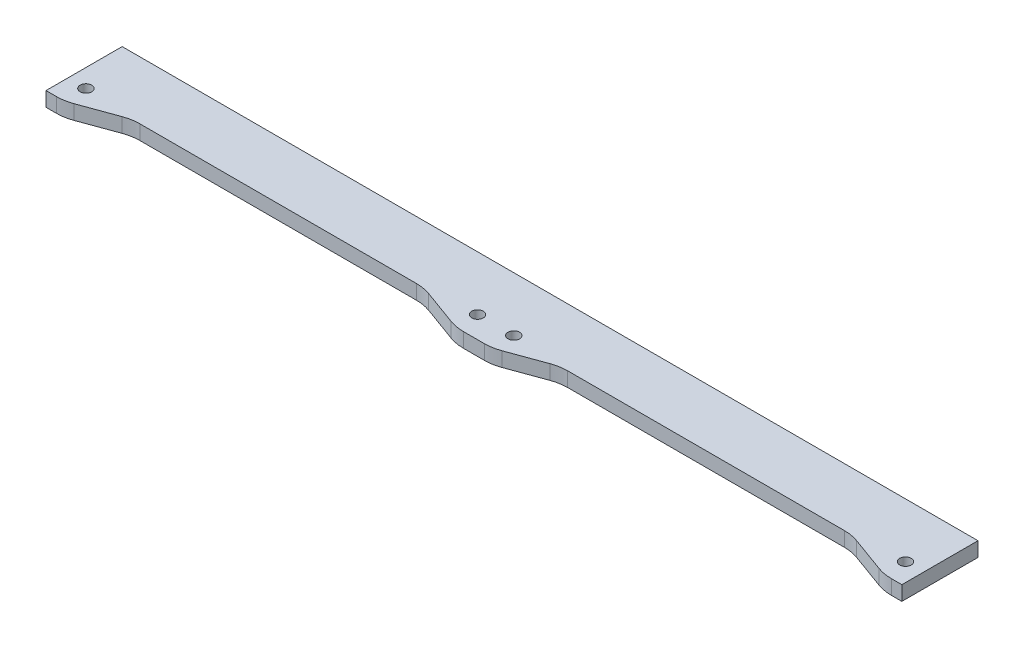
ISO-10303-21;
HEADER;
FILE_DESCRIPTION(('STEP AP214'),'2;1');
FILE_NAME('part.step','',(''),(''),'','','');
FILE_SCHEMA(('AUTOMOTIVE_DESIGN { 1 0 10303 214 1 1 1 1 }'));
ENDSEC;
DATA;
#1=APPLICATION_CONTEXT('core data for automotive mechanical design processes');
#2=APPLICATION_PROTOCOL_DEFINITION('international standard','automotive_design',2000,#1);
#3=PRODUCT_CONTEXT('',#1,'mechanical');
#4=PRODUCT('Part','Part','',(#3));
#5=PRODUCT_RELATED_PRODUCT_CATEGORY('part','',(#4));
#6=PRODUCT_DEFINITION_FORMATION('','',#4);
#7=PRODUCT_DEFINITION_CONTEXT('part definition',#1,'design');
#8=PRODUCT_DEFINITION('design','',#6,#7);
#9=PRODUCT_DEFINITION_SHAPE('','',#8);
#10=(LENGTH_UNIT() NAMED_UNIT(*) SI_UNIT(.MILLI.,.METRE.));
#11=(NAMED_UNIT(*) PLANE_ANGLE_UNIT() SI_UNIT($,.RADIAN.));
#12=(NAMED_UNIT(*) SI_UNIT($,.STERADIAN.) SOLID_ANGLE_UNIT());
#13=UNCERTAINTY_MEASURE_WITH_UNIT(LENGTH_MEASURE(1.E-05),#10,'distance_accuracy_value','');
#14=(GEOMETRIC_REPRESENTATION_CONTEXT(3) GLOBAL_UNCERTAINTY_ASSIGNED_CONTEXT((#13)) GLOBAL_UNIT_ASSIGNED_CONTEXT((#10,
#11,#12)) REPRESENTATION_CONTEXT('',''));
#15=CARTESIAN_POINT('',(0.,0.,0.));
#16=DIRECTION('',(0.,0.,1.));
#17=DIRECTION('',(1.,0.,0.));
#18=AXIS2_PLACEMENT_3D('',#15,#16,#17);
#19=CARTESIAN_POINT('',(39.9880894309982,10.,109.866372758799));
#20=DIRECTION('',(-0.34202014332567,0.,-0.939692620785908));
#21=DIRECTION('',(-0.939692620785908,0.,0.34202014332567));
#22=AXIS2_PLACEMENT_3D('',#19,#20,#21);
#23=PLANE('',#22);
#24=DIRECTION('',(0.939692620785908,0.,-0.34202014332567));
#25=VECTOR('',#24,1.);
#26=CARTESIAN_POINT('',(39.9880894309982,0.,109.866372758799));
#27=LINE('',#26,#25);
#28=CARTESIAN_POINT('',(312.470794878516,0.,10.6907786235773));
#29=VERTEX_POINT('',#28);
#30=CARTESIAN_POINT('',(336.872672864667,0.,1.8092213764227));
#31=VERTEX_POINT('',#30);
#32=EDGE_CURVE('E264',#29,#31,#27,.T.);
#33=ORIENTED_EDGE('',*,*,#32,.T.);
#34=DIRECTION('',(0.,-1.,0.));
#35=VECTOR('',#34,1.);
#36=CARTESIAN_POINT('',(336.872672864667,10.,1.80922137642281));
#37=LINE('',#36,#35);
#38=CARTESIAN_POINT('',(336.872672864667,10.,1.8092213764227));
#39=VERTEX_POINT('',#38);
#40=EDGE_CURVE('E387',#31,#39,#37,.F.);
#41=ORIENTED_EDGE('',*,*,#40,.T.);
#42=DIRECTION('',(0.939692620785908,0.,-0.34202014332567));
#43=VECTOR('',#42,1.);
#44=CARTESIAN_POINT('',(39.9880894309982,10.,109.866372758799));
#45=LINE('',#44,#43);
#46=CARTESIAN_POINT('',(312.470794878516,10.,10.6907786235773));
#47=VERTEX_POINT('',#46);
#48=EDGE_CURVE('E453',#47,#39,#45,.T.);
#49=ORIENTED_EDGE('',*,*,#48,.F.);
#50=DIRECTION('',(0.,-1.,0.));
#51=VECTOR('',#50,1.);
#52=CARTESIAN_POINT('',(312.470794878516,0.,10.6907786235773));
#53=LINE('',#52,#51);
#54=EDGE_CURVE('E383',#47,#29,#53,.T.);
#55=ORIENTED_EDGE('',*,*,#54,.T.);
#56=EDGE_LOOP('',(#33,#41,#49,#55));
#57=FACE_BOUND('',#56,.T.);
#58=ADVANCED_FACE('F46',(#57),#23,.F.);
#59=CARTESIAN_POINT('',(0.,10.,0.));
#60=DIRECTION('',(0.,0.,-1.));
#61=DIRECTION('',(-1.,0.,0.));
#62=AXIS2_PLACEMENT_3D('',#59,#60,#61);
#63=PLANE('',#62);
#64=DIRECTION('',(1.,0.,0.));
#65=VECTOR('',#64,1.);
#66=CARTESIAN_POINT('',(0.,0.,0.));
#67=LINE('',#66,#65);
#68=CARTESIAN_POINT('',(347.133277164437,0.,0.));
#69=VERTEX_POINT('',#68);
#70=CARTESIAN_POINT('',(537.866722835564,0.,0.));
#71=VERTEX_POINT('',#70);
#72=EDGE_CURVE('E268',#69,#71,#67,.T.);
#73=ORIENTED_EDGE('',*,*,#72,.T.);
#74=DIRECTION('',(0.,-1.,0.));
#75=VECTOR('',#74,1.);
#76=CARTESIAN_POINT('',(537.866722835564,10.,0.));
#77=LINE('',#76,#75);
#78=CARTESIAN_POINT('',(537.866722835564,10.,0.));
#79=VERTEX_POINT('',#78);
#80=EDGE_CURVE('E62',#71,#79,#77,.F.);
#81=ORIENTED_EDGE('',*,*,#80,.T.);
#82=DIRECTION('',(1.,0.,0.));
#83=VECTOR('',#82,1.);
#84=CARTESIAN_POINT('',(0.,10.,0.));
#85=LINE('',#84,#83);
#86=CARTESIAN_POINT('',(347.133277164437,10.,0.));
#87=VERTEX_POINT('',#86);
#88=EDGE_CURVE('E220',#87,#79,#85,.T.);
#89=ORIENTED_EDGE('',*,*,#88,.F.);
#90=DIRECTION('',(0.,-1.,0.));
#91=VECTOR('',#90,1.);
#92=CARTESIAN_POINT('',(347.133277164437,0.,0.));
#93=LINE('',#92,#91);
#94=EDGE_CURVE('E377',#87,#69,#93,.T.);
#95=ORIENTED_EDGE('',*,*,#94,.T.);
#96=EDGE_LOOP('',(#73,#81,#89,#95));
#97=FACE_BOUND('',#96,.T.);
#98=ADVANCED_FACE('F488',(#97),#63,.F.);
#99=CARTESIAN_POINT('',(63.537244488855,10.,-174.567144527496));
#100=DIRECTION('',(-0.342020143325671,0.,0.939692620785908));
#101=DIRECTION('',(0.939692620785908,0.,0.342020143325671));
#102=AXIS2_PLACEMENT_3D('',#99,#100,#101);
#103=PLANE('',#102);
#104=DIRECTION('',(-0.939692620785908,0.,-0.342020143325671));
#105=VECTOR('',#104,1.);
#106=CARTESIAN_POINT('',(63.537244488855,0.,-174.567144527496));
#107=LINE('',#106,#105);
#108=CARTESIAN_POINT('',(572.529205121484,0.,10.6907786235771));
#109=VERTEX_POINT('',#108);
#110=CARTESIAN_POINT('',(548.127327135334,0.,1.80922137642281));
#111=VERTEX_POINT('',#110);
#112=EDGE_CURVE('E271',#109,#111,#107,.T.);
#113=ORIENTED_EDGE('',*,*,#112,.F.);
#114=DIRECTION('',(0.,-1.,0.));
#115=VECTOR('',#114,1.);
#116=CARTESIAN_POINT('',(572.529205121484,10.,10.6907786235771));
#117=LINE('',#116,#115);
#118=CARTESIAN_POINT('',(572.529205121484,10.,10.6907786235771));
#119=VERTEX_POINT('',#118);
#120=EDGE_CURVE('E366',#109,#119,#117,.F.);
#121=ORIENTED_EDGE('',*,*,#120,.T.);
#122=DIRECTION('',(-0.939692620785908,0.,-0.342020143325671));
#123=VECTOR('',#122,1.);
#124=CARTESIAN_POINT('',(63.537244488855,10.,-174.567144527496));
#125=LINE('',#124,#123);
#126=CARTESIAN_POINT('',(548.127327135334,10.,1.80922137642281));
#127=VERTEX_POINT('',#126);
#128=EDGE_CURVE('E215',#119,#127,#125,.T.);
#129=ORIENTED_EDGE('',*,*,#128,.T.);
#130=DIRECTION('',(0.,-1.,0.));
#131=VECTOR('',#130,1.);
#132=CARTESIAN_POINT('',(548.127327135334,10.,1.80922137642281));
#133=LINE('',#132,#131);
#134=EDGE_CURVE('E362',#127,#111,#133,.T.);
#135=ORIENTED_EDGE('',*,*,#134,.T.);
#136=EDGE_LOOP('',(#113,#121,#129,#135));
#137=FACE_BOUND('',#136,.T.);
#138=ADVANCED_FACE('F493',(#137),#103,.T.);
#139=CARTESIAN_POINT('',(0.,10.,12.5000000000001));
#140=DIRECTION('',(0.,0.,1.));
#141=DIRECTION('',(1.,0.,0.));
#142=AXIS2_PLACEMENT_3D('',#139,#140,#141);
#143=PLANE('',#142);
#144=DIRECTION('',(-1.,0.,0.));
#145=VECTOR('',#144,1.);
#146=CARTESIAN_POINT('',(0.,10.,12.5000000000001));
#147=LINE('',#146,#145);
#148=CARTESIAN_POINT('',(590.,10.,12.5));
#149=VERTEX_POINT('',#148);
#150=CARTESIAN_POINT('',(582.789809421254,10.,12.5));
#151=VERTEX_POINT('',#150);
#152=EDGE_CURVE('E190',#149,#151,#147,.T.);
#153=ORIENTED_EDGE('',*,*,#152,.T.);
#154=DIRECTION('',(0.,-1.,0.));
#155=VECTOR('',#154,1.);
#156=CARTESIAN_POINT('',(582.789809421254,10.,12.5));
#157=LINE('',#156,#155);
#158=CARTESIAN_POINT('',(582.789809421254,0.,12.5));
#159=VERTEX_POINT('',#158);
#160=EDGE_CURVE('E350',#151,#159,#157,.T.);
#161=ORIENTED_EDGE('',*,*,#160,.T.);
#162=DIRECTION('',(-1.,0.,0.));
#163=VECTOR('',#162,1.);
#164=CARTESIAN_POINT('',(0.,0.,12.5000000000001));
#165=LINE('',#164,#163);
#166=CARTESIAN_POINT('',(590.,0.,12.5));
#167=VERTEX_POINT('',#166);
#168=EDGE_CURVE('E193',#167,#159,#165,.T.);
#169=ORIENTED_EDGE('',*,*,#168,.F.);
#170=DIRECTION('',(0.,-1.,0.));
#171=VECTOR('',#170,1.);
#172=CARTESIAN_POINT('',(590.,10.,12.5));
#173=LINE('',#172,#171);
#174=EDGE_CURVE('E185',#149,#167,#173,.T.);
#175=ORIENTED_EDGE('',*,*,#174,.F.);
#176=EDGE_LOOP('',(#153,#161,#169,#175));
#177=FACE_BOUND('',#176,.T.);
#178=ADVANCED_FACE('F187',(#177),#143,.T.);
#179=CARTESIAN_POINT('',(590.,10.,0.));
#180=DIRECTION('',(-1.,0.,0.));
#181=DIRECTION('',(0.,0.,1.));
#182=AXIS2_PLACEMENT_3D('',#179,#180,#181);
#183=PLANE('',#182);
#184=DIRECTION('',(0.,0.,-1.));
#185=VECTOR('',#184,1.);
#186=CARTESIAN_POINT('',(590.,0.,0.));
#187=LINE('',#186,#185);
#188=CARTESIAN_POINT('',(590.,0.,-40.0000000000001));
#189=VERTEX_POINT('',#188);
#190=EDGE_CURVE('E278',#167,#189,#187,.T.);
#191=ORIENTED_EDGE('',*,*,#190,.T.);
#192=DIRECTION('',(0.,-1.,0.));
#193=VECTOR('',#192,1.);
#194=CARTESIAN_POINT('',(590.,10.,-40.0000000000001));
#195=LINE('',#194,#193);
#196=CARTESIAN_POINT('',(590.,10.,-40.0000000000001));
#197=VERTEX_POINT('',#196);
#198=EDGE_CURVE('E199',#197,#189,#195,.T.);
#199=ORIENTED_EDGE('',*,*,#198,.F.);
#200=DIRECTION('',(0.,0.,-1.));
#201=VECTOR('',#200,1.);
#202=CARTESIAN_POINT('',(590.,10.,0.));
#203=LINE('',#202,#201);
#204=EDGE_CURVE('E202',#149,#197,#203,.T.);
#205=ORIENTED_EDGE('',*,*,#204,.F.);
#206=ORIENTED_EDGE('',*,*,#174,.T.);
#207=EDGE_LOOP('',(#191,#199,#205,#206));
#208=FACE_BOUND('',#207,.T.);
#209=ADVANCED_FACE('F203',(#208),#183,.F.);
#210=CARTESIAN_POINT('',(0.,10.,-40.));
#211=DIRECTION('',(0.,0.,-1.));
#212=DIRECTION('',(-1.,0.,0.));
#213=AXIS2_PLACEMENT_3D('',#210,#211,#212);
#214=PLANE('',#213);
#215=DIRECTION('',(1.,0.,0.));
#216=VECTOR('',#215,1.);
#217=CARTESIAN_POINT('',(0.,0.,-40.));
#218=LINE('',#217,#216);
#219=CARTESIAN_POINT('',(0.,0.,-40.));
#220=VERTEX_POINT('',#219);
#221=EDGE_CURVE('E281',#220,#189,#218,.T.);
#222=ORIENTED_EDGE('',*,*,#221,.F.);
#223=DIRECTION('',(0.,-1.,0.));
#224=VECTOR('',#223,1.);
#225=CARTESIAN_POINT('',(0.,10.,-40.));
#226=LINE('',#225,#224);
#227=CARTESIAN_POINT('',(0.,10.,-40.));
#228=VERTEX_POINT('',#227);
#229=EDGE_CURVE('E320',#228,#220,#226,.T.);
#230=ORIENTED_EDGE('',*,*,#229,.F.);
#231=DIRECTION('',(1.,0.,0.));
#232=VECTOR('',#231,1.);
#233=CARTESIAN_POINT('',(0.,10.,-40.));
#234=LINE('',#233,#232);
#235=EDGE_CURVE('E207',#228,#197,#234,.T.);
#236=ORIENTED_EDGE('',*,*,#235,.T.);
#237=ORIENTED_EDGE('',*,*,#198,.T.);
#238=EDGE_LOOP('',(#222,#230,#236,#237));
#239=FACE_BOUND('',#238,.T.);
#240=ADVANCED_FACE('F661',(#239),#214,.T.);
#241=CARTESIAN_POINT('',(0.,10.,0.));
#242=DIRECTION('',(-1.,0.,0.));
#243=DIRECTION('',(0.,0.,1.));
#244=AXIS2_PLACEMENT_3D('',#241,#242,#243);
#245=PLANE('',#244);
#246=DIRECTION('',(0.,0.,-1.));
#247=VECTOR('',#246,1.);
#248=CARTESIAN_POINT('',(0.,0.,0.));
#249=LINE('',#248,#247);
#250=CARTESIAN_POINT('',(0.,0.,12.5));
#251=VERTEX_POINT('',#250);
#252=EDGE_CURVE('E285',#251,#220,#249,.T.);
#253=ORIENTED_EDGE('',*,*,#252,.F.);
#254=DIRECTION('',(0.,-1.,0.));
#255=VECTOR('',#254,1.);
#256=CARTESIAN_POINT('',(0.,10.,12.5));
#257=LINE('',#256,#255);
#258=CARTESIAN_POINT('',(0.,10.,12.5));
#259=VERTEX_POINT('',#258);
#260=EDGE_CURVE('E259',#259,#251,#257,.T.);
#261=ORIENTED_EDGE('',*,*,#260,.F.);
#262=DIRECTION('',(0.,0.,-1.));
#263=VECTOR('',#262,1.);
#264=CARTESIAN_POINT('',(0.,10.,0.));
#265=LINE('',#264,#263);
#266=EDGE_CURVE('E226',#259,#228,#265,.T.);
#267=ORIENTED_EDGE('',*,*,#266,.T.);
#268=ORIENTED_EDGE('',*,*,#229,.T.);
#269=EDGE_LOOP('',(#253,#261,#267,#268));
#270=FACE_BOUND('',#269,.T.);
#271=ADVANCED_FACE('F651',(#270),#245,.T.);
#272=CARTESIAN_POINT('',(0.,10.,12.5));
#273=DIRECTION('',(0.,0.,-1.));
#274=DIRECTION('',(-1.,0.,0.));
#275=AXIS2_PLACEMENT_3D('',#272,#273,#274);
#276=PLANE('',#275);
#277=DIRECTION('',(1.,0.,0.));
#278=VECTOR('',#277,1.);
#279=CARTESIAN_POINT('',(0.,0.,12.5));
#280=LINE('',#279,#278);
#281=CARTESIAN_POINT('',(7.21019057874603,0.,12.5));
#282=VERTEX_POINT('',#281);
#283=EDGE_CURVE('E289',#251,#282,#280,.T.);
#284=ORIENTED_EDGE('',*,*,#283,.T.);
#285=DIRECTION('',(0.,-1.,0.));
#286=VECTOR('',#285,1.);
#287=CARTESIAN_POINT('',(7.21019057874603,10.,12.5));
#288=LINE('',#287,#286);
#289=CARTESIAN_POINT('',(7.21019057874603,10.,12.5));
#290=VERTEX_POINT('',#289);
#291=EDGE_CURVE('E338',#282,#290,#288,.F.);
#292=ORIENTED_EDGE('',*,*,#291,.T.);
#293=DIRECTION('',(1.,0.,0.));
#294=VECTOR('',#293,1.);
#295=CARTESIAN_POINT('',(0.,10.,12.5));
#296=LINE('',#295,#294);
#297=EDGE_CURVE('E230',#259,#290,#296,.T.);
#298=ORIENTED_EDGE('',*,*,#297,.F.);
#299=ORIENTED_EDGE('',*,*,#260,.T.);
#300=EDGE_LOOP('',(#284,#292,#298,#299));
#301=FACE_BOUND('',#300,.T.);
#302=ADVANCED_FACE('F641',(#301),#276,.F.);
#303=CARTESIAN_POINT('',(5.47964479104729,10.,15.0552003300345));
#304=DIRECTION('',(-0.34202014332567,0.,-0.939692620785908));
#305=DIRECTION('',(-0.939692620785908,0.,0.34202014332567));
#306=AXIS2_PLACEMENT_3D('',#303,#304,#305);
#307=PLANE('',#306);
#308=DIRECTION('',(0.939692620785908,0.,-0.34202014332567));
#309=VECTOR('',#308,1.);
#310=CARTESIAN_POINT('',(5.47964479104729,0.,15.0552003300345));
#311=LINE('',#310,#309);
#312=CARTESIAN_POINT('',(17.4707948785161,0.,10.6907786235773));
#313=VERTEX_POINT('',#312);
#314=CARTESIAN_POINT('',(41.8726728646665,0.,1.80922137642281));
#315=VERTEX_POINT('',#314);
#316=EDGE_CURVE('E293',#313,#315,#311,.T.);
#317=ORIENTED_EDGE('',*,*,#316,.T.);
#318=DIRECTION('',(0.,-1.,0.));
#319=VECTOR('',#318,1.);
#320=CARTESIAN_POINT('',(41.8726728646665,10.,1.80922137642281));
#321=LINE('',#320,#319);
#322=CARTESIAN_POINT('',(41.8726728646665,10.,1.80922137642281));
#323=VERTEX_POINT('',#322);
#324=EDGE_CURVE('E332',#315,#323,#321,.F.);
#325=ORIENTED_EDGE('',*,*,#324,.T.);
#326=DIRECTION('',(0.939692620785908,0.,-0.34202014332567));
#327=VECTOR('',#326,1.);
#328=CARTESIAN_POINT('',(5.47964479104729,10.,15.0552003300345));
#329=LINE('',#328,#327);
#330=CARTESIAN_POINT('',(17.4707948785161,10.,10.6907786235773));
#331=VERTEX_POINT('',#330);
#332=EDGE_CURVE('E234',#331,#323,#329,.T.);
#333=ORIENTED_EDGE('',*,*,#332,.F.);
#334=DIRECTION('',(0.,-1.,0.));
#335=VECTOR('',#334,1.);
#336=CARTESIAN_POINT('',(17.4707948785161,10.,10.6907786235773));
#337=LINE('',#336,#335);
#338=EDGE_CURVE('E328',#331,#313,#337,.T.);
#339=ORIENTED_EDGE('',*,*,#338,.T.);
#340=EDGE_LOOP('',(#317,#325,#333,#339));
#341=FACE_BOUND('',#340,.T.);
#342=ADVANCED_FACE('F633',(#341),#307,.F.);
#343=CARTESIAN_POINT('',(52.1332771644366,0.,0.));
#344=VERTEX_POINT('',#343);
#345=CARTESIAN_POINT('',(242.866722835563,0.,0.));
#346=VERTEX_POINT('',#345);
#347=EDGE_CURVE('E272',#344,#346,#67,.T.);
#348=ORIENTED_EDGE('',*,*,#347,.T.);
#349=DIRECTION('',(0.,-1.,0.));
#350=VECTOR('',#349,1.);
#351=CARTESIAN_POINT('',(242.866722835563,10.,0.));
#352=LINE('',#351,#350);
#353=CARTESIAN_POINT('',(242.866722835563,10.,0.));
#354=VERTEX_POINT('',#353);
#355=EDGE_CURVE('E404',#346,#354,#352,.F.);
#356=ORIENTED_EDGE('',*,*,#355,.T.);
#357=CARTESIAN_POINT('',(52.1332771644366,10.,0.));
#358=VERTEX_POINT('',#357);
#359=EDGE_CURVE('E238',#358,#354,#85,.T.);
#360=ORIENTED_EDGE('',*,*,#359,.F.);
#361=DIRECTION('',(0.,-1.,0.));
#362=VECTOR('',#361,1.);
#363=CARTESIAN_POINT('',(52.1332771644366,0.,0.));
#364=LINE('',#363,#362);
#365=EDGE_CURVE('E198',#358,#344,#364,.T.);
#366=ORIENTED_EDGE('',*,*,#365,.T.);
#367=EDGE_LOOP('',(#348,#356,#360,#366));
#368=FACE_BOUND('',#367,.T.);
#369=ADVANCED_FACE('F429',(#368),#63,.F.);
#370=CARTESIAN_POINT('',(29.0287998489036,10.,-79.7559720987302));
#371=DIRECTION('',(-0.342020143325669,0.,0.939692620785908));
#372=DIRECTION('',(0.939692620785908,0.,0.342020143325669));
#373=AXIS2_PLACEMENT_3D('',#370,#371,#372);
#374=PLANE('',#373);
#375=DIRECTION('',(-0.939692620785908,0.,-0.342020143325669));
#376=VECTOR('',#375,1.);
#377=CARTESIAN_POINT('',(29.0287998489036,10.,-79.7559720987302));
#378=LINE('',#377,#376);
#379=CARTESIAN_POINT('',(277.529205121484,10.,10.6907786235773));
#380=VERTEX_POINT('',#379);
#381=CARTESIAN_POINT('',(253.127327135333,10.,1.80922137642281));
#382=VERTEX_POINT('',#381);
#383=EDGE_CURVE('E239',#380,#382,#378,.T.);
#384=ORIENTED_EDGE('',*,*,#383,.T.);
#385=DIRECTION('',(0.,-1.,0.));
#386=VECTOR('',#385,1.);
#387=CARTESIAN_POINT('',(253.127327135333,10.,1.8092213764227));
#388=LINE('',#387,#386);
#389=CARTESIAN_POINT('',(253.127327135333,0.,1.80922137642281));
#390=VERTEX_POINT('',#389);
#391=EDGE_CURVE('E400',#382,#390,#388,.T.);
#392=ORIENTED_EDGE('',*,*,#391,.T.);
#393=DIRECTION('',(-0.939692620785908,0.,-0.342020143325669));
#394=VECTOR('',#393,1.);
#395=CARTESIAN_POINT('',(29.0287998489036,0.,-79.7559720987302));
#396=LINE('',#395,#394);
#397=CARTESIAN_POINT('',(277.529205121484,0.,10.6907786235773));
#398=VERTEX_POINT('',#397);
#399=EDGE_CURVE('E297',#398,#390,#396,.T.);
#400=ORIENTED_EDGE('',*,*,#399,.F.);
#401=DIRECTION('',(0.,-1.,0.));
#402=VECTOR('',#401,1.);
#403=CARTESIAN_POINT('',(277.529205121484,10.,10.6907786235773));
#404=LINE('',#403,#402);
#405=EDGE_CURVE('E397',#398,#380,#404,.F.);
#406=ORIENTED_EDGE('',*,*,#405,.T.);
#407=EDGE_LOOP('',(#384,#392,#400,#406));
#408=FACE_BOUND('',#407,.T.);
#409=ADVANCED_FACE('F439',(#408),#374,.T.);
#410=CARTESIAN_POINT('',(12.5,10.,-2.5));
#411=DIRECTION('',(0.,-1.,0.));
#412=DIRECTION('',(0.,0.,-1.));
#413=AXIS2_PLACEMENT_3D('',#410,#411,#412);
#414=CYLINDRICAL_SURFACE('',#413,4.);
#415=CARTESIAN_POINT('',(12.5,10.,-2.5));
#416=DIRECTION('',(0.,1.,0.));
#417=DIRECTION('',(0.,0.,1.));
#418=AXIS2_PLACEMENT_3D('',#415,#416,#417);
#419=CIRCLE('',#418,4.);
#420=CARTESIAN_POINT('',(12.5,10.,1.5));
#421=VERTEX_POINT('',#420);
#422=EDGE_CURVE('E251',#421,#421,#419,.T.);
#423=ORIENTED_EDGE('',*,*,#422,.T.);
#424=EDGE_LOOP('',(#423));
#425=FACE_BOUND('',#424,.T.);
#426=CARTESIAN_POINT('',(12.5,0.,-2.5));
#427=DIRECTION('',(0.,1.,0.));
#428=DIRECTION('',(0.,0.,1.));
#429=AXIS2_PLACEMENT_3D('',#426,#427,#428);
#430=CIRCLE('',#429,4.);
#431=CARTESIAN_POINT('',(12.5,0.,1.5));
#432=VERTEX_POINT('',#431);
#433=EDGE_CURVE('E309',#432,#432,#430,.T.);
#434=ORIENTED_EDGE('',*,*,#433,.F.);
#435=EDGE_LOOP('',(#434));
#436=FACE_BOUND('',#435,.T.);
#437=ADVANCED_FACE('F606',(#425,#436),#414,.F.);
#438=CARTESIAN_POINT('',(577.5,10.,-2.50000000000006));
#439=DIRECTION('',(0.,-1.,0.));
#440=DIRECTION('',(0.,0.,-1.));
#441=AXIS2_PLACEMENT_3D('',#438,#439,#440);
#442=CYLINDRICAL_SURFACE('',#441,3.99999999999999);
#443=CARTESIAN_POINT('',(577.5,10.,-2.50000000000006));
#444=DIRECTION('',(0.,1.,0.));
#445=DIRECTION('',(0.,0.,1.));
#446=AXIS2_PLACEMENT_3D('',#443,#444,#445);
#447=CIRCLE('',#446,3.99999999999999);
#448=CARTESIAN_POINT('',(577.5,10.,1.49999999999993));
#449=VERTEX_POINT('',#448);
#450=EDGE_CURVE('E247',#449,#449,#447,.F.);
#451=ORIENTED_EDGE('',*,*,#450,.F.);
#452=EDGE_LOOP('',(#451));
#453=FACE_BOUND('',#452,.T.);
#454=CARTESIAN_POINT('',(577.5,0.,-2.50000000000006));
#455=DIRECTION('',(0.,1.,0.));
#456=DIRECTION('',(0.,0.,1.));
#457=AXIS2_PLACEMENT_3D('',#454,#455,#456);
#458=CIRCLE('',#457,3.99999999999999);
#459=CARTESIAN_POINT('',(577.5,0.,1.49999999999993));
#460=VERTEX_POINT('',#459);
#461=EDGE_CURVE('E305',#460,#460,#458,.F.);
#462=ORIENTED_EDGE('',*,*,#461,.T.);
#463=EDGE_LOOP('',(#462));
#464=FACE_BOUND('',#463,.T.);
#465=ADVANCED_FACE('F597',(#453,#464),#442,.F.);
#466=CARTESIAN_POINT('',(0.,10.,12.5000000000001));
#467=DIRECTION('',(0.,0.,1.));
#468=DIRECTION('',(1.,0.,0.));
#469=AXIS2_PLACEMENT_3D('',#466,#467,#468);
#470=PLANE('',#469);
#471=DIRECTION('',(-1.,0.,0.));
#472=VECTOR('',#471,1.);
#473=CARTESIAN_POINT('',(0.,0.,12.5000000000001));
#474=LINE('',#473,#472);
#475=CARTESIAN_POINT('',(302.210190578746,0.,12.5));
#476=VERTEX_POINT('',#475);
#477=CARTESIAN_POINT('',(287.789809421254,0.,12.5));
#478=VERTEX_POINT('',#477);
#479=EDGE_CURVE('E301',#476,#478,#474,.T.);
#480=ORIENTED_EDGE('',*,*,#479,.F.);
#481=DIRECTION('',(0.,-1.,0.));
#482=VECTOR('',#481,1.);
#483=CARTESIAN_POINT('',(302.210190578746,10.,12.5));
#484=LINE('',#483,#482);
#485=CARTESIAN_POINT('',(302.210190578746,10.,12.5));
#486=VERTEX_POINT('',#485);
#487=EDGE_CURVE('E394',#476,#486,#484,.F.);
#488=ORIENTED_EDGE('',*,*,#487,.T.);
#489=DIRECTION('',(-1.,0.,0.));
#490=VECTOR('',#489,1.);
#491=CARTESIAN_POINT('',(0.,10.,12.5000000000001));
#492=LINE('',#491,#490);
#493=CARTESIAN_POINT('',(287.789809421254,10.,12.5));
#494=VERTEX_POINT('',#493);
#495=EDGE_CURVE('E243',#486,#494,#492,.T.);
#496=ORIENTED_EDGE('',*,*,#495,.T.);
#497=DIRECTION('',(0.,-1.,0.));
#498=VECTOR('',#497,1.);
#499=CARTESIAN_POINT('',(287.789809421254,10.,12.5));
#500=LINE('',#499,#498);
#501=EDGE_CURVE('E390',#494,#478,#500,.T.);
#502=ORIENTED_EDGE('',*,*,#501,.T.);
#503=EDGE_LOOP('',(#480,#488,#496,#502));
#504=FACE_BOUND('',#503,.T.);
#505=ADVANCED_FACE('F447',(#504),#470,.T.);
#506=CARTESIAN_POINT('',(307.5,10.,-2.5));
#507=DIRECTION('',(0.,-1.,0.));
#508=DIRECTION('',(0.,0.,-1.));
#509=AXIS2_PLACEMENT_3D('',#506,#507,#508);
#510=CYLINDRICAL_SURFACE('',#509,3.99999999999999);
#511=CARTESIAN_POINT('',(307.5,10.,-2.5));
#512=DIRECTION('',(0.,1.,0.));
#513=DIRECTION('',(0.,0.,1.));
#514=AXIS2_PLACEMENT_3D('',#511,#512,#513);
#515=CIRCLE('',#514,3.99999999999999);
#516=CARTESIAN_POINT('',(307.5,10.,1.49999999999999));
#517=VERTEX_POINT('',#516);
#518=EDGE_CURVE('E317',#517,#517,#515,.F.);
#519=ORIENTED_EDGE('',*,*,#518,.F.);
#520=EDGE_LOOP('',(#519));
#521=FACE_BOUND('',#520,.T.);
#522=CARTESIAN_POINT('',(307.5,0.,-2.5));
#523=DIRECTION('',(0.,1.,0.));
#524=DIRECTION('',(0.,0.,1.));
#525=AXIS2_PLACEMENT_3D('',#522,#523,#524);
#526=CIRCLE('',#525,3.99999999999999);
#527=CARTESIAN_POINT('',(307.5,0.,1.49999999999999));
#528=VERTEX_POINT('',#527);
#529=EDGE_CURVE('E260',#528,#528,#526,.F.);
#530=ORIENTED_EDGE('',*,*,#529,.T.);
#531=EDGE_LOOP('',(#530));
#532=FACE_BOUND('',#531,.T.);
#533=ADVANCED_FACE('F468',(#521,#532),#510,.F.);
#534=CARTESIAN_POINT('',(282.5,10.,-2.5));
#535=DIRECTION('',(0.,-1.,0.));
#536=DIRECTION('',(0.,0.,-1.));
#537=AXIS2_PLACEMENT_3D('',#534,#535,#536);
#538=CYLINDRICAL_SURFACE('',#537,3.99999999999999);
#539=CARTESIAN_POINT('',(282.5,10.,-2.5));
#540=DIRECTION('',(0.,1.,0.));
#541=DIRECTION('',(0.,0.,1.));
#542=AXIS2_PLACEMENT_3D('',#539,#540,#541);
#543=CIRCLE('',#542,3.99999999999999);
#544=CARTESIAN_POINT('',(282.5,10.,1.49999999999999));
#545=VERTEX_POINT('',#544);
#546=EDGE_CURVE('E255',#545,#545,#543,.T.);
#547=ORIENTED_EDGE('',*,*,#546,.T.);
#548=EDGE_LOOP('',(#547));
#549=FACE_BOUND('',#548,.T.);
#550=CARTESIAN_POINT('',(282.5,0.,-2.5));
#551=DIRECTION('',(0.,1.,0.));
#552=DIRECTION('',(0.,0.,1.));
#553=AXIS2_PLACEMENT_3D('',#550,#551,#552);
#554=CIRCLE('',#553,3.99999999999999);
#555=CARTESIAN_POINT('',(282.5,0.,1.49999999999999));
#556=VERTEX_POINT('',#555);
#557=EDGE_CURVE('E313',#556,#556,#554,.T.);
#558=ORIENTED_EDGE('',*,*,#557,.F.);
#559=EDGE_LOOP('',(#558));
#560=FACE_BOUND('',#559,.T.);
#561=ADVANCED_FACE('F471',(#549,#560),#538,.F.);
#562=CARTESIAN_POINT('',(0.,10.,0.));
#563=DIRECTION('',(0.,1.,0.));
#564=DIRECTION('',(0.,0.,1.));
#565=AXIS2_PLACEMENT_3D('',#562,#563,#564);
#566=PLANE('',#565);
#567=ORIENTED_EDGE('',*,*,#518,.T.);
#568=EDGE_LOOP('',(#567));
#569=FACE_BOUND('',#568,.T.);
#570=ORIENTED_EDGE('',*,*,#128,.F.);
#571=CARTESIAN_POINT('',(582.789809421254,10.,-17.5000000000001));
#572=DIRECTION('',(0.,1.,0.));
#573=DIRECTION('',(0.,0.,1.));
#574=AXIS2_PLACEMENT_3D('',#571,#572,#573);
#575=CIRCLE('',#574,30.);
#576=EDGE_CURVE('E213',#119,#151,#575,.T.);
#577=ORIENTED_EDGE('',*,*,#576,.T.);
#578=ORIENTED_EDGE('',*,*,#152,.F.);
#579=ORIENTED_EDGE('',*,*,#204,.T.);
#580=ORIENTED_EDGE('',*,*,#235,.F.);
#581=ORIENTED_EDGE('',*,*,#266,.F.);
#582=ORIENTED_EDGE('',*,*,#297,.T.);
#583=CARTESIAN_POINT('',(7.21019057874603,10.,-17.5));
#584=DIRECTION('',(0.,1.,0.));
#585=DIRECTION('',(0.,0.,1.));
#586=AXIS2_PLACEMENT_3D('',#583,#584,#585);
#587=CIRCLE('',#586,30.);
#588=EDGE_CURVE('E341',#290,#331,#587,.T.);
#589=ORIENTED_EDGE('',*,*,#588,.T.);
#590=ORIENTED_EDGE('',*,*,#332,.T.);
#591=CARTESIAN_POINT('',(52.1332771644366,10.,30.));
#592=DIRECTION('',(0.,1.,0.));
#593=DIRECTION('',(0.,0.,1.));
#594=AXIS2_PLACEMENT_3D('',#591,#592,#593);
#595=CIRCLE('',#594,30.);
#596=EDGE_CURVE('E347',#323,#358,#595,.F.);
#597=ORIENTED_EDGE('',*,*,#596,.T.);
#598=ORIENTED_EDGE('',*,*,#359,.T.);
#599=CARTESIAN_POINT('',(242.866722835563,10.,30.));
#600=DIRECTION('',(0.,1.,0.));
#601=DIRECTION('',(0.,0.,1.));
#602=AXIS2_PLACEMENT_3D('',#599,#600,#601);
#603=CIRCLE('',#602,30.);
#604=EDGE_CURVE('E11',#354,#382,#603,.F.);
#605=ORIENTED_EDGE('',*,*,#604,.T.);
#606=ORIENTED_EDGE('',*,*,#383,.F.);
#607=CARTESIAN_POINT('',(287.789809421254,10.,-17.5));
#608=DIRECTION('',(0.,1.,0.));
#609=DIRECTION('',(0.,0.,1.));
#610=AXIS2_PLACEMENT_3D('',#607,#608,#609);
#611=CIRCLE('',#610,30.);
#612=EDGE_CURVE('E369',#380,#494,#611,.T.);
#613=ORIENTED_EDGE('',*,*,#612,.T.);
#614=ORIENTED_EDGE('',*,*,#495,.F.);
#615=CARTESIAN_POINT('',(302.210190578746,10.,-17.5));
#616=DIRECTION('',(0.,1.,0.));
#617=DIRECTION('',(0.,0.,1.));
#618=AXIS2_PLACEMENT_3D('',#615,#616,#617);
#619=CIRCLE('',#618,30.);
#620=EDGE_CURVE('E372',#486,#47,#619,.T.);
#621=ORIENTED_EDGE('',*,*,#620,.T.);
#622=ORIENTED_EDGE('',*,*,#48,.T.);
#623=CARTESIAN_POINT('',(347.133277164437,10.,30.));
#624=DIRECTION('',(0.,1.,0.));
#625=DIRECTION('',(0.,0.,1.));
#626=AXIS2_PLACEMENT_3D('',#623,#624,#625);
#627=CIRCLE('',#626,30.);
#628=EDGE_CURVE('E69',#39,#87,#627,.F.);
#629=ORIENTED_EDGE('',*,*,#628,.T.);
#630=ORIENTED_EDGE('',*,*,#88,.T.);
#631=CARTESIAN_POINT('',(537.866722835564,10.,30.));
#632=DIRECTION('',(0.,1.,0.));
#633=DIRECTION('',(0.,0.,1.));
#634=AXIS2_PLACEMENT_3D('',#631,#632,#633);
#635=CIRCLE('',#634,30.);
#636=EDGE_CURVE('E410',#79,#127,#635,.F.);
#637=ORIENTED_EDGE('',*,*,#636,.T.);
#638=EDGE_LOOP('',(#570,#577,#578,#579,#580,#581,#582,#589,#590,#597,#598,#605,#606,#613,#614,
#621,#622,#629,#630,#637));
#639=FACE_BOUND('',#638,.T.);
#640=ORIENTED_EDGE('',*,*,#450,.T.);
#641=EDGE_LOOP('',(#640));
#642=FACE_BOUND('',#641,.T.);
#643=ORIENTED_EDGE('',*,*,#422,.F.);
#644=EDGE_LOOP('',(#643));
#645=FACE_BOUND('',#644,.T.);
#646=ORIENTED_EDGE('',*,*,#546,.F.);
#647=EDGE_LOOP('',(#646));
#648=FACE_BOUND('',#647,.T.);
#649=ADVANCED_FACE('F210',(#569,#639,#642,#645,#648),#566,.T.);
#650=CARTESIAN_POINT('',(0.,0.,0.));
#651=DIRECTION('',(0.,1.,0.));
#652=DIRECTION('',(0.,0.,1.));
#653=AXIS2_PLACEMENT_3D('',#650,#651,#652);
#654=PLANE('',#653);
#655=ORIENTED_EDGE('',*,*,#529,.F.);
#656=EDGE_LOOP('',(#655));
#657=FACE_BOUND('',#656,.T.);
#658=ORIENTED_EDGE('',*,*,#168,.T.);
#659=CARTESIAN_POINT('',(582.789809421254,0.,-17.5000000000001));
#660=DIRECTION('',(0.,1.,0.));
#661=DIRECTION('',(0.,0.,1.));
#662=AXIS2_PLACEMENT_3D('',#659,#660,#661);
#663=CIRCLE('',#662,30.);
#664=EDGE_CURVE('E359',#159,#109,#663,.F.);
#665=ORIENTED_EDGE('',*,*,#664,.T.);
#666=ORIENTED_EDGE('',*,*,#112,.T.);
#667=CARTESIAN_POINT('',(537.866722835564,0.,30.));
#668=DIRECTION('',(0.,1.,0.));
#669=DIRECTION('',(0.,0.,1.));
#670=AXIS2_PLACEMENT_3D('',#667,#668,#669);
#671=CIRCLE('',#670,30.);
#672=EDGE_CURVE('E407',#111,#71,#671,.T.);
#673=ORIENTED_EDGE('',*,*,#672,.T.);
#674=ORIENTED_EDGE('',*,*,#72,.F.);
#675=CARTESIAN_POINT('',(347.133277164437,0.,30.));
#676=DIRECTION('',(0.,1.,0.));
#677=DIRECTION('',(0.,0.,1.));
#678=AXIS2_PLACEMENT_3D('',#675,#676,#677);
#679=CIRCLE('',#678,30.);
#680=EDGE_CURVE('E413',#69,#31,#679,.T.);
#681=ORIENTED_EDGE('',*,*,#680,.T.);
#682=ORIENTED_EDGE('',*,*,#32,.F.);
#683=CARTESIAN_POINT('',(302.210190578746,0.,-17.5));
#684=DIRECTION('',(0.,1.,0.));
#685=DIRECTION('',(0.,0.,1.));
#686=AXIS2_PLACEMENT_3D('',#683,#684,#685);
#687=CIRCLE('',#686,30.);
#688=EDGE_CURVE('E356',#29,#476,#687,.F.);
#689=ORIENTED_EDGE('',*,*,#688,.T.);
#690=ORIENTED_EDGE('',*,*,#479,.T.);
#691=CARTESIAN_POINT('',(287.789809421254,0.,-17.5));
#692=DIRECTION('',(0.,1.,0.));
#693=DIRECTION('',(0.,0.,1.));
#694=AXIS2_PLACEMENT_3D('',#691,#692,#693);
#695=CIRCLE('',#694,30.);
#696=EDGE_CURVE('E353',#478,#398,#695,.F.);
#697=ORIENTED_EDGE('',*,*,#696,.T.);
#698=ORIENTED_EDGE('',*,*,#399,.T.);
#699=CARTESIAN_POINT('',(242.866722835563,0.,30.));
#700=DIRECTION('',(0.,1.,0.));
#701=DIRECTION('',(0.,0.,1.));
#702=AXIS2_PLACEMENT_3D('',#699,#700,#701);
#703=CIRCLE('',#702,30.);
#704=EDGE_CURVE('E55',#390,#346,#703,.T.);
#705=ORIENTED_EDGE('',*,*,#704,.T.);
#706=ORIENTED_EDGE('',*,*,#347,.F.);
#707=CARTESIAN_POINT('',(52.1332771644366,0.,30.));
#708=DIRECTION('',(0.,1.,0.));
#709=DIRECTION('',(0.,0.,1.));
#710=AXIS2_PLACEMENT_3D('',#707,#708,#709);
#711=CIRCLE('',#710,30.);
#712=EDGE_CURVE('E344',#344,#315,#711,.T.);
#713=ORIENTED_EDGE('',*,*,#712,.T.);
#714=ORIENTED_EDGE('',*,*,#316,.F.);
#715=CARTESIAN_POINT('',(7.21019057874603,0.,-17.5));
#716=DIRECTION('',(0.,1.,0.));
#717=DIRECTION('',(0.,0.,1.));
#718=AXIS2_PLACEMENT_3D('',#715,#716,#717);
#719=CIRCLE('',#718,30.);
#720=EDGE_CURVE('E335',#313,#282,#719,.F.);
#721=ORIENTED_EDGE('',*,*,#720,.T.);
#722=ORIENTED_EDGE('',*,*,#283,.F.);
#723=ORIENTED_EDGE('',*,*,#252,.T.);
#724=ORIENTED_EDGE('',*,*,#221,.T.);
#725=ORIENTED_EDGE('',*,*,#190,.F.);
#726=EDGE_LOOP('',(#658,#665,#666,#673,#674,#681,#682,#689,#690,#697,#698,#705,#706,#713,#714,
#721,#722,#723,#724,#725));
#727=FACE_BOUND('',#726,.T.);
#728=ORIENTED_EDGE('',*,*,#461,.F.);
#729=EDGE_LOOP('',(#728));
#730=FACE_BOUND('',#729,.T.);
#731=ORIENTED_EDGE('',*,*,#433,.T.);
#732=EDGE_LOOP('',(#731));
#733=FACE_BOUND('',#732,.T.);
#734=ORIENTED_EDGE('',*,*,#557,.T.);
#735=EDGE_LOOP('',(#734));
#736=FACE_BOUND('',#735,.T.);
#737=ADVANCED_FACE('F422',(#657,#727,#730,#733,#736),#654,.F.);
#738=CARTESIAN_POINT('',(52.1332771644366,10.,30.));
#739=DIRECTION('',(0.,1.,0.));
#740=DIRECTION('',(0.,0.,1.));
#741=AXIS2_PLACEMENT_3D('',#738,#739,#740);
#742=CYLINDRICAL_SURFACE('',#741,30.);
#743=ORIENTED_EDGE('',*,*,#596,.F.);
#744=ORIENTED_EDGE('',*,*,#324,.F.);
#745=ORIENTED_EDGE('',*,*,#712,.F.);
#746=ORIENTED_EDGE('',*,*,#365,.F.);
#747=EDGE_LOOP('',(#743,#744,#745,#746));
#748=FACE_BOUND('',#747,.T.);
#749=ADVANCED_FACE('F476',(#748),#742,.F.);
#750=CARTESIAN_POINT('',(7.21019057874603,10.,-17.5));
#751=DIRECTION('',(0.,-1.,0.));
#752=DIRECTION('',(0.,0.,-1.));
#753=AXIS2_PLACEMENT_3D('',#750,#751,#752);
#754=CYLINDRICAL_SURFACE('',#753,30.);
#755=ORIENTED_EDGE('',*,*,#588,.F.);
#756=ORIENTED_EDGE('',*,*,#291,.F.);
#757=ORIENTED_EDGE('',*,*,#720,.F.);
#758=ORIENTED_EDGE('',*,*,#338,.F.);
#759=EDGE_LOOP('',(#755,#756,#757,#758));
#760=FACE_BOUND('',#759,.T.);
#761=ADVANCED_FACE('F482',(#760),#754,.T.);
#762=CARTESIAN_POINT('',(582.789809421254,10.,-17.5000000000001));
#763=DIRECTION('',(0.,-1.,0.));
#764=DIRECTION('',(0.,0.,-1.));
#765=AXIS2_PLACEMENT_3D('',#762,#763,#764);
#766=CYLINDRICAL_SURFACE('',#765,30.);
#767=ORIENTED_EDGE('',*,*,#576,.F.);
#768=ORIENTED_EDGE('',*,*,#120,.F.);
#769=ORIENTED_EDGE('',*,*,#664,.F.);
#770=ORIENTED_EDGE('',*,*,#160,.F.);
#771=EDGE_LOOP('',(#767,#768,#769,#770));
#772=FACE_BOUND('',#771,.T.);
#773=ADVANCED_FACE('F500',(#772),#766,.T.);
#774=CARTESIAN_POINT('',(537.866722835564,10.,30.));
#775=DIRECTION('',(0.,-1.,0.));
#776=DIRECTION('',(0.,0.,-1.));
#777=AXIS2_PLACEMENT_3D('',#774,#775,#776);
#778=CYLINDRICAL_SURFACE('',#777,30.);
#779=ORIENTED_EDGE('',*,*,#636,.F.);
#780=ORIENTED_EDGE('',*,*,#80,.F.);
#781=ORIENTED_EDGE('',*,*,#672,.F.);
#782=ORIENTED_EDGE('',*,*,#134,.F.);
#783=EDGE_LOOP('',(#779,#780,#781,#782));
#784=FACE_BOUND('',#783,.T.);
#785=ADVANCED_FACE('F504',(#784),#778,.F.);
#786=CARTESIAN_POINT('',(347.133277164437,10.,30.));
#787=DIRECTION('',(0.,1.,0.));
#788=DIRECTION('',(0.,0.,1.));
#789=AXIS2_PLACEMENT_3D('',#786,#787,#788);
#790=CYLINDRICAL_SURFACE('',#789,30.);
#791=ORIENTED_EDGE('',*,*,#628,.F.);
#792=ORIENTED_EDGE('',*,*,#40,.F.);
#793=ORIENTED_EDGE('',*,*,#680,.F.);
#794=ORIENTED_EDGE('',*,*,#94,.F.);
#795=EDGE_LOOP('',(#791,#792,#793,#794));
#796=FACE_BOUND('',#795,.T.);
#797=ADVANCED_FACE('F508',(#796),#790,.F.);
#798=CARTESIAN_POINT('',(302.210190578746,10.,-17.5));
#799=DIRECTION('',(0.,1.,0.));
#800=DIRECTION('',(0.,0.,1.));
#801=AXIS2_PLACEMENT_3D('',#798,#799,#800);
#802=CYLINDRICAL_SURFACE('',#801,30.);
#803=ORIENTED_EDGE('',*,*,#620,.F.);
#804=ORIENTED_EDGE('',*,*,#487,.F.);
#805=ORIENTED_EDGE('',*,*,#688,.F.);
#806=ORIENTED_EDGE('',*,*,#54,.F.);
#807=EDGE_LOOP('',(#803,#804,#805,#806));
#808=FACE_BOUND('',#807,.T.);
#809=ADVANCED_FACE('F450',(#808),#802,.T.);
#810=CARTESIAN_POINT('',(242.866722835563,10.,30.));
#811=DIRECTION('',(0.,-1.,0.));
#812=DIRECTION('',(0.,0.,-1.));
#813=AXIS2_PLACEMENT_3D('',#810,#811,#812);
#814=CYLINDRICAL_SURFACE('',#813,30.);
#815=ORIENTED_EDGE('',*,*,#604,.F.);
#816=ORIENTED_EDGE('',*,*,#355,.F.);
#817=ORIENTED_EDGE('',*,*,#704,.F.);
#818=ORIENTED_EDGE('',*,*,#391,.F.);
#819=EDGE_LOOP('',(#815,#816,#817,#818));
#820=FACE_BOUND('',#819,.T.);
#821=ADVANCED_FACE('F435',(#820),#814,.F.);
#822=CARTESIAN_POINT('',(287.789809421254,10.,-17.5));
#823=DIRECTION('',(0.,-1.,0.));
#824=DIRECTION('',(0.,0.,-1.));
#825=AXIS2_PLACEMENT_3D('',#822,#823,#824);
#826=CYLINDRICAL_SURFACE('',#825,30.);
#827=ORIENTED_EDGE('',*,*,#612,.F.);
#828=ORIENTED_EDGE('',*,*,#405,.F.);
#829=ORIENTED_EDGE('',*,*,#696,.F.);
#830=ORIENTED_EDGE('',*,*,#501,.F.);
#831=EDGE_LOOP('',(#827,#828,#829,#830));
#832=FACE_BOUND('',#831,.T.);
#833=ADVANCED_FACE('F48',(#832),#826,.T.);
#834=CLOSED_SHELL('',(#58,#98,#138,#178,#209,#240,#271,#302,#342,#369,#409,#437,#465,#505,#533,
#561,#649,#737,#749,#761,#773,#785,#797,#809,#821,#833));
#835=MANIFOLD_SOLID_BREP('B2',#834);
#836=ADVANCED_BREP_SHAPE_REPRESENTATION('',(#18,#835),#14);
#837=SHAPE_DEFINITION_REPRESENTATION(#9,#836);
ENDSEC;
END-ISO-10303-21;
